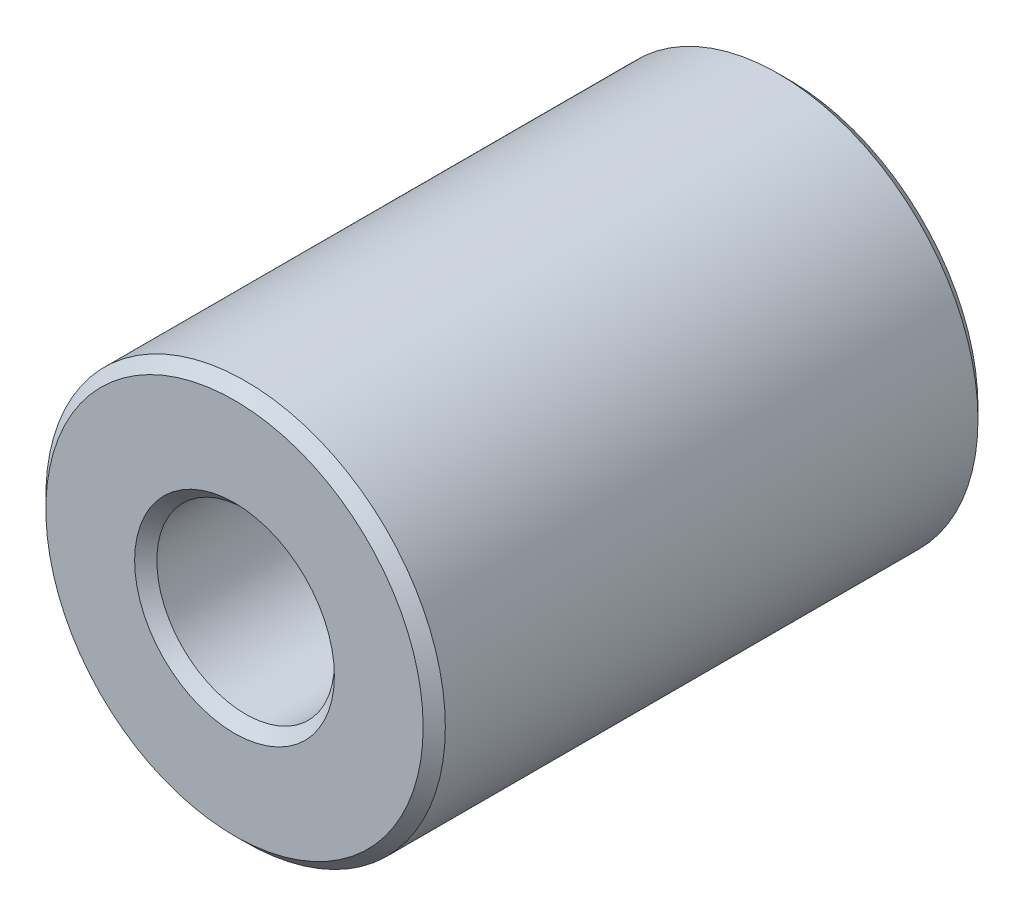
ISO-10303-21;
HEADER;
FILE_DESCRIPTION(('STEP AP214'),'2;1');
FILE_NAME('part.step','',(''),(''),'','','');
FILE_SCHEMA(('AUTOMOTIVE_DESIGN { 1 0 10303 214 1 1 1 1 }'));
ENDSEC;
DATA;
#1=APPLICATION_CONTEXT('core data for automotive mechanical design processes');
#2=APPLICATION_PROTOCOL_DEFINITION('international standard','automotive_design',2000,#1);
#3=PRODUCT_CONTEXT('',#1,'mechanical');
#4=PRODUCT('Part','Part','',(#3));
#5=PRODUCT_RELATED_PRODUCT_CATEGORY('part','',(#4));
#6=PRODUCT_DEFINITION_FORMATION('','',#4);
#7=PRODUCT_DEFINITION_CONTEXT('part definition',#1,'design');
#8=PRODUCT_DEFINITION('design','',#6,#7);
#9=PRODUCT_DEFINITION_SHAPE('','',#8);
#10=(LENGTH_UNIT() NAMED_UNIT(*) SI_UNIT(.MILLI.,.METRE.));
#11=(NAMED_UNIT(*) PLANE_ANGLE_UNIT() SI_UNIT($,.RADIAN.));
#12=(NAMED_UNIT(*) SI_UNIT($,.STERADIAN.) SOLID_ANGLE_UNIT());
#13=UNCERTAINTY_MEASURE_WITH_UNIT(LENGTH_MEASURE(1.E-05),#10,'distance_accuracy_value','');
#14=(GEOMETRIC_REPRESENTATION_CONTEXT(3) GLOBAL_UNCERTAINTY_ASSIGNED_CONTEXT((#13)) GLOBAL_UNIT_ASSIGNED_CONTEXT((#10,
#11,#12)) REPRESENTATION_CONTEXT('',''));
#15=CARTESIAN_POINT('',(0.,0.,0.));
#16=DIRECTION('',(0.,0.,1.));
#17=DIRECTION('',(1.,0.,0.));
#18=AXIS2_PLACEMENT_3D('',#15,#16,#17);
#19=CARTESIAN_POINT('',(0.,0.,25.));
#20=DIRECTION('',(0.,0.,-1.));
#21=DIRECTION('',(-1.,0.,0.));
#22=AXIS2_PLACEMENT_3D('',#19,#20,#21);
#23=CYLINDRICAL_SURFACE('',#22,9.);
#24=CARTESIAN_POINT('',(0.,0.,24.5));
#25=DIRECTION('',(0.,0.,1.));
#26=DIRECTION('',(1.,0.,0.));
#27=AXIS2_PLACEMENT_3D('',#24,#25,#26);
#28=CIRCLE('',#27,9.);
#29=CARTESIAN_POINT('',(9.,0.,24.5));
#30=VERTEX_POINT('',#29);
#31=EDGE_CURVE('E49',#30,#30,#28,.F.);
#32=ORIENTED_EDGE('',*,*,#31,.T.);
#33=EDGE_LOOP('',(#32));
#34=FACE_BOUND('',#33,.T.);
#35=CARTESIAN_POINT('',(0.,0.,0.5));
#36=DIRECTION('',(0.,0.,1.));
#37=DIRECTION('',(1.,0.,0.));
#38=AXIS2_PLACEMENT_3D('',#35,#36,#37);
#39=CIRCLE('',#38,9.);
#40=CARTESIAN_POINT('',(9.,0.,0.5));
#41=VERTEX_POINT('',#40);
#42=EDGE_CURVE('E54',#41,#41,#39,.T.);
#43=ORIENTED_EDGE('',*,*,#42,.T.);
#44=EDGE_LOOP('',(#43));
#45=FACE_BOUND('',#44,.T.);
#46=ADVANCED_FACE('F34',(#34,#45),#23,.T.);
#47=CARTESIAN_POINT('',(0.,0.,25.));
#48=DIRECTION('',(0.,0.,1.));
#49=DIRECTION('',(1.,0.,0.));
#50=AXIS2_PLACEMENT_3D('',#47,#48,#49);
#51=PLANE('',#50);
#52=CARTESIAN_POINT('',(0.,0.,25.));
#53=DIRECTION('',(0.,0.,1.));
#54=DIRECTION('',(1.,0.,0.));
#55=AXIS2_PLACEMENT_3D('',#52,#53,#54);
#56=CIRCLE('',#55,4.50000000000001);
#57=CARTESIAN_POINT('',(4.50000000000001,0.,25.));
#58=VERTEX_POINT('',#57);
#59=EDGE_CURVE('E57',#58,#58,#56,.F.);
#60=ORIENTED_EDGE('',*,*,#59,.T.);
#61=EDGE_LOOP('',(#60));
#62=FACE_BOUND('',#61,.T.);
#63=CARTESIAN_POINT('',(0.,0.,25.));
#64=DIRECTION('',(0.,0.,1.));
#65=DIRECTION('',(1.,0.,0.));
#66=AXIS2_PLACEMENT_3D('',#63,#64,#65);
#67=CIRCLE('',#66,8.5);
#68=CARTESIAN_POINT('',(8.5,0.,25.));
#69=VERTEX_POINT('',#68);
#70=EDGE_CURVE('E60',#69,#69,#67,.T.);
#71=ORIENTED_EDGE('',*,*,#70,.T.);
#72=EDGE_LOOP('',(#71));
#73=FACE_BOUND('',#72,.T.);
#74=ADVANCED_FACE('F89',(#62,#73),#51,.T.);
#75=CARTESIAN_POINT('',(0.,0.,0.));
#76=DIRECTION('',(0.,0.,1.));
#77=DIRECTION('',(1.,0.,0.));
#78=AXIS2_PLACEMENT_3D('',#75,#76,#77);
#79=PLANE('',#78);
#80=CARTESIAN_POINT('',(0.,0.,0.));
#81=DIRECTION('',(0.,0.,1.));
#82=DIRECTION('',(1.,0.,0.));
#83=AXIS2_PLACEMENT_3D('',#80,#81,#82);
#84=CIRCLE('',#83,8.49999999999999);
#85=CARTESIAN_POINT('',(8.49999999999999,0.,0.));
#86=VERTEX_POINT('',#85);
#87=EDGE_CURVE('E41',#86,#86,#84,.F.);
#88=ORIENTED_EDGE('',*,*,#87,.T.);
#89=EDGE_LOOP('',(#88));
#90=FACE_BOUND('',#89,.T.);
#91=CARTESIAN_POINT('',(0.,0.,0.));
#92=DIRECTION('',(0.,0.,1.));
#93=DIRECTION('',(1.,0.,0.));
#94=AXIS2_PLACEMENT_3D('',#91,#92,#93);
#95=CIRCLE('',#94,3.);
#96=CARTESIAN_POINT('',(3.,0.,0.));
#97=VERTEX_POINT('',#96);
#98=EDGE_CURVE('E45',#97,#97,#95,.T.);
#99=ORIENTED_EDGE('',*,*,#98,.T.);
#100=EDGE_LOOP('',(#99));
#101=FACE_BOUND('',#100,.T.);
#102=ADVANCED_FACE('F95',(#90,#101),#79,.F.);
#103=CARTESIAN_POINT('',(0.,0.,15.));
#104=DIRECTION('',(0.,0.,1.));
#105=DIRECTION('',(1.,0.,0.));
#106=AXIS2_PLACEMENT_3D('',#103,#104,#105);
#107=CYLINDRICAL_SURFACE('',#106,4.);
#108=CARTESIAN_POINT('',(0.,0.,24.5));
#109=DIRECTION('',(0.,0.,1.));
#110=DIRECTION('',(1.,0.,0.));
#111=AXIS2_PLACEMENT_3D('',#108,#109,#110);
#112=CIRCLE('',#111,4.);
#113=CARTESIAN_POINT('',(4.,0.,24.5));
#114=VERTEX_POINT('',#113);
#115=EDGE_CURVE('E63',#114,#114,#112,.T.);
#116=ORIENTED_EDGE('',*,*,#115,.T.);
#117=EDGE_LOOP('',(#116));
#118=FACE_BOUND('',#117,.T.);
#119=CARTESIAN_POINT('',(0.,0.,15.));
#120=DIRECTION('',(0.,0.,1.));
#121=DIRECTION('',(1.,0.,0.));
#122=AXIS2_PLACEMENT_3D('',#119,#120,#121);
#123=CIRCLE('',#122,4.);
#124=CARTESIAN_POINT('',(4.,0.,15.));
#125=VERTEX_POINT('',#124);
#126=EDGE_CURVE('E66',#125,#125,#123,.T.);
#127=ORIENTED_EDGE('',*,*,#126,.F.);
#128=EDGE_LOOP('',(#127));
#129=FACE_BOUND('',#128,.T.);
#130=ADVANCED_FACE('F85',(#118,#129),#107,.F.);
#131=CARTESIAN_POINT('',(0.,0.,15.));
#132=DIRECTION('',(0.,0.,1.));
#133=DIRECTION('',(1.,0.,0.));
#134=AXIS2_PLACEMENT_3D('',#131,#132,#133);
#135=PLANE('',#134);
#136=ORIENTED_EDGE('',*,*,#126,.T.);
#137=EDGE_LOOP('',(#136));
#138=FACE_BOUND('',#137,.T.);
#139=ADVANCED_FACE('F77',(#138),#135,.T.);
#140=CARTESIAN_POINT('',(0.,0.,10.));
#141=DIRECTION('',(0.,0.,-1.));
#142=DIRECTION('',(-1.,0.,0.));
#143=AXIS2_PLACEMENT_3D('',#140,#141,#142);
#144=CYLINDRICAL_SURFACE('',#143,2.5);
#145=CARTESIAN_POINT('',(0.,0.,0.499999999999997));
#146=DIRECTION('',(0.,0.,1.));
#147=DIRECTION('',(1.,0.,0.));
#148=AXIS2_PLACEMENT_3D('',#145,#146,#147);
#149=CIRCLE('',#148,2.5);
#150=CARTESIAN_POINT('',(2.5,0.,0.499999999999997));
#151=VERTEX_POINT('',#150);
#152=EDGE_CURVE('E10',#151,#151,#149,.F.);
#153=ORIENTED_EDGE('',*,*,#152,.T.);
#154=EDGE_LOOP('',(#153));
#155=FACE_BOUND('',#154,.T.);
#156=CARTESIAN_POINT('',(0.,0.,10.));
#157=DIRECTION('',(0.,0.,-1.));
#158=DIRECTION('',(-1.,0.,0.));
#159=AXIS2_PLACEMENT_3D('',#156,#157,#158);
#160=CIRCLE('',#159,2.5);
#161=CARTESIAN_POINT('',(-2.5,0.,10.));
#162=VERTEX_POINT('',#161);
#163=EDGE_CURVE('E69',#162,#162,#160,.T.);
#164=ORIENTED_EDGE('',*,*,#163,.F.);
#165=EDGE_LOOP('',(#164));
#166=FACE_BOUND('',#165,.T.);
#167=ADVANCED_FACE('F75',(#155,#166),#144,.F.);
#168=CARTESIAN_POINT('',(0.,0.,10.));
#169=DIRECTION('',(0.,0.,-1.));
#170=DIRECTION('',(-1.,0.,0.));
#171=AXIS2_PLACEMENT_3D('',#168,#169,#170);
#172=PLANE('',#171);
#173=ORIENTED_EDGE('',*,*,#163,.T.);
#174=EDGE_LOOP('',(#173));
#175=FACE_BOUND('',#174,.T.);
#176=ADVANCED_FACE('F73',(#175),#172,.T.);
#177=CARTESIAN_POINT('',(0.,0.,24.5));
#178=DIRECTION('',(0.,0.,1.));
#179=DIRECTION('',(1.,0.,0.));
#180=AXIS2_PLACEMENT_3D('',#177,#178,#179);
#181=CONICAL_SURFACE('',#180,4.,0.785398163397455);
#182=ORIENTED_EDGE('',*,*,#59,.F.);
#183=EDGE_LOOP('',(#182));
#184=FACE_BOUND('',#183,.T.);
#185=ORIENTED_EDGE('',*,*,#115,.F.);
#186=EDGE_LOOP('',(#185));
#187=FACE_BOUND('',#186,.T.);
#188=ADVANCED_FACE('F83',(#184,#187),#181,.F.);
#189=CARTESIAN_POINT('',(0.,0.,25.));
#190=DIRECTION('',(0.,0.,-1.));
#191=DIRECTION('',(-1.,0.,0.));
#192=AXIS2_PLACEMENT_3D('',#189,#190,#191);
#193=CONICAL_SURFACE('',#192,8.5,0.785398163397443);
#194=ORIENTED_EDGE('',*,*,#31,.F.);
#195=EDGE_LOOP('',(#194));
#196=FACE_BOUND('',#195,.T.);
#197=ORIENTED_EDGE('',*,*,#70,.F.);
#198=EDGE_LOOP('',(#197));
#199=FACE_BOUND('',#198,.T.);
#200=ADVANCED_FACE('F103',(#196,#199),#193,.T.);
#201=CARTESIAN_POINT('',(0.,0.,0.5));
#202=DIRECTION('',(0.,0.,1.));
#203=DIRECTION('',(1.,0.,0.));
#204=AXIS2_PLACEMENT_3D('',#201,#202,#203);
#205=CONICAL_SURFACE('',#204,9.,0.785398163397454);
#206=ORIENTED_EDGE('',*,*,#87,.F.);
#207=EDGE_LOOP('',(#206));
#208=FACE_BOUND('',#207,.T.);
#209=ORIENTED_EDGE('',*,*,#42,.F.);
#210=EDGE_LOOP('',(#209));
#211=FACE_BOUND('',#210,.T.);
#212=ADVANCED_FACE('F106',(#208,#211),#205,.T.);
#213=CARTESIAN_POINT('',(0.,0.,0.499999999999997));
#214=DIRECTION('',(0.,0.,-1.));
#215=DIRECTION('',(-1.,0.,0.));
#216=AXIS2_PLACEMENT_3D('',#213,#214,#215);
#217=CONICAL_SURFACE('',#216,2.5,0.78539816339745);
#218=ORIENTED_EDGE('',*,*,#98,.F.);
#219=EDGE_LOOP('',(#218));
#220=FACE_BOUND('',#219,.T.);
#221=ORIENTED_EDGE('',*,*,#152,.F.);
#222=EDGE_LOOP('',(#221));
#223=FACE_BOUND('',#222,.T.);
#224=ADVANCED_FACE('F36',(#220,#223),#217,.F.);
#225=CLOSED_SHELL('',(#46,#74,#102,#130,#139,#167,#176,#188,#200,#212,#224));
#226=MANIFOLD_SOLID_BREP('B2',#225);
#227=ADVANCED_BREP_SHAPE_REPRESENTATION('',(#18,#226),#14);
#228=SHAPE_DEFINITION_REPRESENTATION(#9,#227);
ENDSEC;
END-ISO-10303-21;
